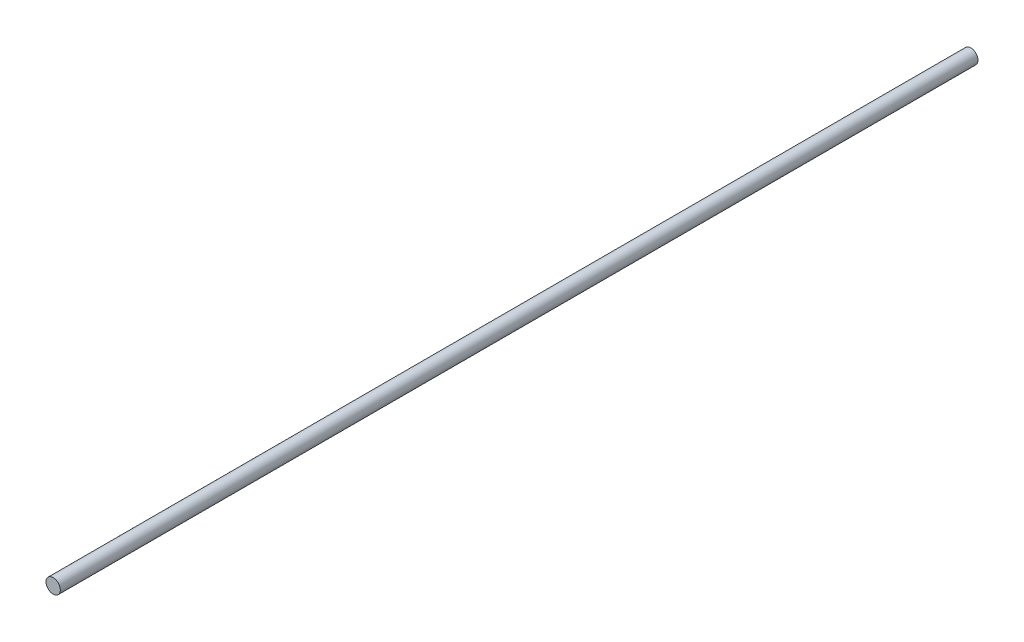
ISO-10303-21;
HEADER;
FILE_DESCRIPTION(('STEP AP214'),'2;1');
FILE_NAME('part.step','',(''),(''),'','','');
FILE_SCHEMA(('AUTOMOTIVE_DESIGN { 1 0 10303 214 1 1 1 1 }'));
ENDSEC;
DATA;
#1=APPLICATION_CONTEXT('core data for automotive mechanical design processes');
#2=APPLICATION_PROTOCOL_DEFINITION('international standard','automotive_design',2000,#1);
#3=PRODUCT_CONTEXT('',#1,'mechanical');
#4=PRODUCT('Part','Part','',(#3));
#5=PRODUCT_RELATED_PRODUCT_CATEGORY('part','',(#4));
#6=PRODUCT_DEFINITION_FORMATION('','',#4);
#7=PRODUCT_DEFINITION_CONTEXT('part definition',#1,'design');
#8=PRODUCT_DEFINITION('design','',#6,#7);
#9=PRODUCT_DEFINITION_SHAPE('','',#8);
#10=(LENGTH_UNIT() NAMED_UNIT(*) SI_UNIT(.MILLI.,.METRE.));
#11=(NAMED_UNIT(*) PLANE_ANGLE_UNIT() SI_UNIT($,.RADIAN.));
#12=(NAMED_UNIT(*) SI_UNIT($,.STERADIAN.) SOLID_ANGLE_UNIT());
#13=UNCERTAINTY_MEASURE_WITH_UNIT(LENGTH_MEASURE(1.E-05),#10,'distance_accuracy_value','');
#14=(GEOMETRIC_REPRESENTATION_CONTEXT(3) GLOBAL_UNCERTAINTY_ASSIGNED_CONTEXT((#13)) GLOBAL_UNIT_ASSIGNED_CONTEXT((#10,
#11,#12)) REPRESENTATION_CONTEXT('',''));
#15=CARTESIAN_POINT('',(0.,0.,0.));
#16=DIRECTION('',(0.,0.,1.));
#17=DIRECTION('',(1.,0.,0.));
#18=AXIS2_PLACEMENT_3D('',#15,#16,#17);
#19=CARTESIAN_POINT('',(0.,0.,203.2));
#20=DIRECTION('',(0.,0.,-1.));
#21=DIRECTION('',(-1.,0.,0.));
#22=AXIS2_PLACEMENT_3D('',#19,#20,#21);
#23=CYLINDRICAL_SURFACE('',#22,1.5875);
#24=CARTESIAN_POINT('',(0.,0.,203.2));
#25=DIRECTION('',(0.,0.,1.));
#26=DIRECTION('',(1.,0.,0.));
#27=AXIS2_PLACEMENT_3D('',#24,#25,#26);
#28=CIRCLE('',#27,1.5875);
#29=CARTESIAN_POINT('',(1.5875,0.,203.2));
#30=VERTEX_POINT('',#29);
#31=EDGE_CURVE('E10',#30,#30,#28,.T.);
#32=ORIENTED_EDGE('',*,*,#31,.F.);
#33=EDGE_LOOP('',(#32));
#34=FACE_BOUND('',#33,.T.);
#35=CARTESIAN_POINT('',(0.,0.,0.));
#36=DIRECTION('',(0.,0.,1.));
#37=DIRECTION('',(1.,0.,0.));
#38=AXIS2_PLACEMENT_3D('',#35,#36,#37);
#39=CIRCLE('',#38,1.5875);
#40=CARTESIAN_POINT('',(1.5875,0.,0.));
#41=VERTEX_POINT('',#40);
#42=EDGE_CURVE('E46',#41,#41,#39,.T.);
#43=ORIENTED_EDGE('',*,*,#42,.T.);
#44=EDGE_LOOP('',(#43));
#45=FACE_BOUND('',#44,.T.);
#46=ADVANCED_FACE('F43',(#34,#45),#23,.T.);
#47=CARTESIAN_POINT('',(0.,0.,203.2));
#48=DIRECTION('',(0.,0.,1.));
#49=DIRECTION('',(1.,0.,0.));
#50=AXIS2_PLACEMENT_3D('',#47,#48,#49);
#51=PLANE('',#50);
#52=ORIENTED_EDGE('',*,*,#31,.T.);
#53=EDGE_LOOP('',(#52));
#54=FACE_BOUND('',#53,.T.);
#55=ADVANCED_FACE('F60',(#54),#51,.T.);
#56=CARTESIAN_POINT('',(0.,0.,0.));
#57=DIRECTION('',(0.,0.,1.));
#58=DIRECTION('',(1.,0.,0.));
#59=AXIS2_PLACEMENT_3D('',#56,#57,#58);
#60=PLANE('',#59);
#61=ORIENTED_EDGE('',*,*,#42,.F.);
#62=EDGE_LOOP('',(#61));
#63=FACE_BOUND('',#62,.T.);
#64=ADVANCED_FACE('F58',(#63),#60,.F.);
#65=CLOSED_SHELL('',(#46,#55,#64));
#66=MANIFOLD_SOLID_BREP('B2',#65);
#67=ADVANCED_BREP_SHAPE_REPRESENTATION('',(#18,#66),#14);
#68=SHAPE_DEFINITION_REPRESENTATION(#9,#67);
ENDSEC;
END-ISO-10303-21;
